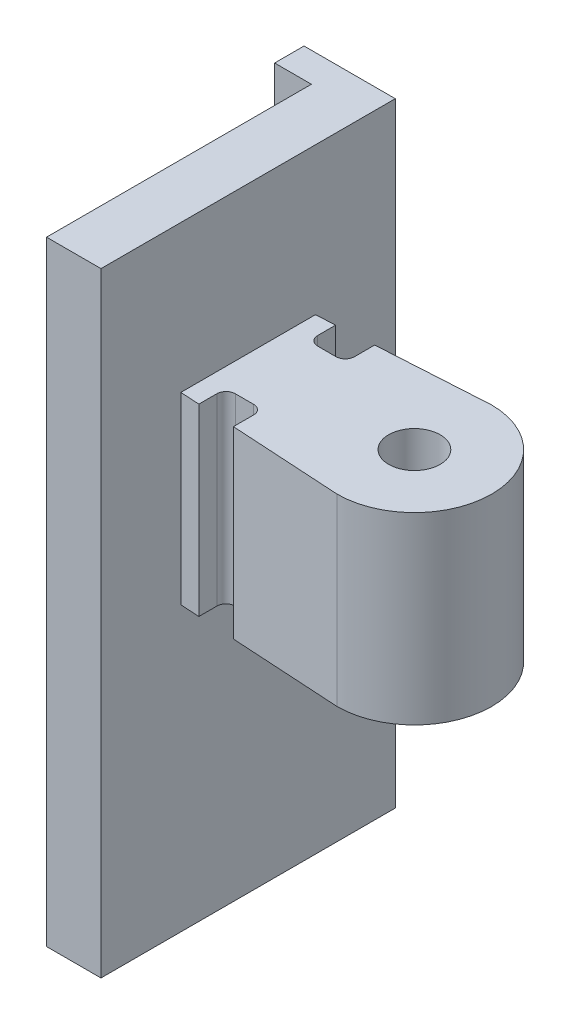
ISO-10303-21;
HEADER;
FILE_DESCRIPTION(('STEP AP214'),'2;1');
FILE_NAME('part.step','',(''),(''),'','','');
FILE_SCHEMA(('AUTOMOTIVE_DESIGN { 1 0 10303 214 1 1 1 1 }'));
ENDSEC;
DATA;
#1=APPLICATION_CONTEXT('core data for automotive mechanical design processes');
#2=APPLICATION_PROTOCOL_DEFINITION('international standard','automotive_design',2000,#1);
#3=PRODUCT_CONTEXT('',#1,'mechanical');
#4=PRODUCT('Part','Part','',(#3));
#5=PRODUCT_RELATED_PRODUCT_CATEGORY('part','',(#4));
#6=PRODUCT_DEFINITION_FORMATION('','',#4);
#7=PRODUCT_DEFINITION_CONTEXT('part definition',#1,'design');
#8=PRODUCT_DEFINITION('design','',#6,#7);
#9=PRODUCT_DEFINITION_SHAPE('','',#8);
#10=(LENGTH_UNIT() NAMED_UNIT(*) SI_UNIT(.MILLI.,.METRE.));
#11=(NAMED_UNIT(*) PLANE_ANGLE_UNIT() SI_UNIT($,.RADIAN.));
#12=(NAMED_UNIT(*) SI_UNIT($,.STERADIAN.) SOLID_ANGLE_UNIT());
#13=UNCERTAINTY_MEASURE_WITH_UNIT(LENGTH_MEASURE(1.E-05),#10,'distance_accuracy_value','');
#14=(GEOMETRIC_REPRESENTATION_CONTEXT(3) GLOBAL_UNCERTAINTY_ASSIGNED_CONTEXT((#13)) GLOBAL_UNIT_ASSIGNED_CONTEXT((#10,
#11,#12)) REPRESENTATION_CONTEXT('',''));
#15=CARTESIAN_POINT('',(0.,0.,0.));
#16=DIRECTION('',(0.,0.,1.));
#17=DIRECTION('',(1.,0.,0.));
#18=AXIS2_PLACEMENT_3D('',#15,#16,#17);
#19=CARTESIAN_POINT('',(-2.26000000000002,0.,0.));
#20=DIRECTION('',(-1.,0.,0.));
#21=DIRECTION('',(0.,0.,1.));
#22=AXIS2_PLACEMENT_3D('',#19,#20,#21);
#23=PLANE('',#22);
#24=DIRECTION('',(0.,-1.,0.));
#25=VECTOR('',#24,1.);
#26=CARTESIAN_POINT('',(-2.26000000000002,4.5,-2.));
#27=LINE('',#26,#25);
#28=CARTESIAN_POINT('',(-2.26000000000002,4.5,-2.));
#29=VERTEX_POINT('',#28);
#30=CARTESIAN_POINT('',(-2.26000000000002,-3.85,-2.));
#31=VERTEX_POINT('',#30);
#32=EDGE_CURVE('E190',#29,#31,#27,.T.);
#33=ORIENTED_EDGE('',*,*,#32,.F.);
#34=DIRECTION('',(0.,0.,-1.));
#35=VECTOR('',#34,1.);
#36=CARTESIAN_POINT('',(-2.26000000000002,4.5,-2.));
#37=LINE('',#36,#35);
#38=CARTESIAN_POINT('',(-2.26000000000002,4.5,2.));
#39=VERTEX_POINT('',#38);
#40=EDGE_CURVE('E195',#39,#29,#37,.T.);
#41=ORIENTED_EDGE('',*,*,#40,.F.);
#42=DIRECTION('',(0.,1.,0.));
#43=VECTOR('',#42,1.);
#44=CARTESIAN_POINT('',(-2.26000000000002,4.5,2.));
#45=LINE('',#44,#43);
#46=CARTESIAN_POINT('',(-2.26000000000002,-3.85,2.));
#47=VERTEX_POINT('',#46);
#48=EDGE_CURVE('E230',#47,#39,#45,.T.);
#49=ORIENTED_EDGE('',*,*,#48,.F.);
#50=DIRECTION('',(0.,0.,1.));
#51=VECTOR('',#50,1.);
#52=CARTESIAN_POINT('',(-2.26000000000002,-3.85,-2.));
#53=LINE('',#52,#51);
#54=EDGE_CURVE('E228',#31,#47,#53,.T.);
#55=ORIENTED_EDGE('',*,*,#54,.F.);
#56=EDGE_LOOP('',(#33,#41,#49,#55));
#57=FACE_BOUND('',#56,.T.);
#58=DIRECTION('',(0.,1.,0.));
#59=VECTOR('',#58,1.);
#60=CARTESIAN_POINT('',(-2.26000000000002,2.5,0.9144));
#61=LINE('',#60,#59);
#62=CARTESIAN_POINT('',(-2.26000000000002,0.,0.9144));
#63=VERTEX_POINT('',#62);
#64=CARTESIAN_POINT('',(-2.26000000000002,2.5,0.9144));
#65=VERTEX_POINT('',#64);
#66=EDGE_CURVE('E241',#63,#65,#61,.T.);
#67=ORIENTED_EDGE('',*,*,#66,.T.);
#68=DIRECTION('',(0.,0.,-1.));
#69=VECTOR('',#68,1.);
#70=CARTESIAN_POINT('',(-2.26000000000002,2.5,0.));
#71=LINE('',#70,#69);
#72=CARTESIAN_POINT('',(-2.26000000000002,2.5,-0.9144));
#73=VERTEX_POINT('',#72);
#74=EDGE_CURVE('E243',#65,#73,#71,.T.);
#75=ORIENTED_EDGE('',*,*,#74,.T.);
#76=DIRECTION('',(0.,1.,0.));
#77=VECTOR('',#76,1.);
#78=CARTESIAN_POINT('',(-2.26000000000002,2.5,-0.9144));
#79=LINE('',#78,#77);
#80=CARTESIAN_POINT('',(-2.26000000000002,0.,-0.9144));
#81=VERTEX_POINT('',#80);
#82=EDGE_CURVE('E59',#81,#73,#79,.T.);
#83=ORIENTED_EDGE('',*,*,#82,.F.);
#84=DIRECTION('',(0.,0.,-1.));
#85=VECTOR('',#84,1.);
#86=CARTESIAN_POINT('',(-2.26000000000002,0.,0.));
#87=LINE('',#86,#85);
#88=EDGE_CURVE('E11',#63,#81,#87,.T.);
#89=ORIENTED_EDGE('',*,*,#88,.F.);
#90=EDGE_LOOP('',(#67,#75,#83,#89));
#91=FACE_BOUND('',#90,.T.);
#92=ADVANCED_FACE('F36',(#57,#91),#23,.F.);
#93=CARTESIAN_POINT('',(-2.26000000000002,4.5,-2.));
#94=DIRECTION('',(0.,0.,-1.));
#95=DIRECTION('',(0.,1.,0.));
#96=AXIS2_PLACEMENT_3D('',#93,#94,#95);
#97=PLANE('',#96);
#98=DIRECTION('',(-1.,0.,0.));
#99=VECTOR('',#98,1.);
#100=CARTESIAN_POINT('',(-2.26000000000002,-3.85,-2.));
#101=LINE('',#100,#99);
#102=CARTESIAN_POINT('',(-3.50000000000002,-3.85,-2.));
#103=VERTEX_POINT('',#102);
#104=EDGE_CURVE('E184',#31,#103,#101,.T.);
#105=ORIENTED_EDGE('',*,*,#104,.T.);
#106=DIRECTION('',(0.,-1.,0.));
#107=VECTOR('',#106,1.);
#108=CARTESIAN_POINT('',(-3.50000000000002,-3.85,-2.));
#109=LINE('',#108,#107);
#110=CARTESIAN_POINT('',(-3.50000000000002,4.5,-2.));
#111=VERTEX_POINT('',#110);
#112=EDGE_CURVE('E188',#111,#103,#109,.T.);
#113=ORIENTED_EDGE('',*,*,#112,.F.);
#114=DIRECTION('',(-1.,0.,0.));
#115=VECTOR('',#114,1.);
#116=CARTESIAN_POINT('',(-2.26000000000002,4.5,-2.));
#117=LINE('',#116,#115);
#118=EDGE_CURVE('E235',#29,#111,#117,.T.);
#119=ORIENTED_EDGE('',*,*,#118,.F.);
#120=ORIENTED_EDGE('',*,*,#32,.T.);
#121=EDGE_LOOP('',(#105,#113,#119,#120));
#122=FACE_BOUND('',#121,.T.);
#123=ADVANCED_FACE('F186',(#122),#97,.T.);
#124=CARTESIAN_POINT('',(-2.26000000000002,4.5,-2.));
#125=DIRECTION('',(0.,1.,0.));
#126=DIRECTION('',(0.,0.,1.));
#127=AXIS2_PLACEMENT_3D('',#124,#125,#126);
#128=PLANE('',#127);
#129=ORIENTED_EDGE('',*,*,#118,.T.);
#130=DIRECTION('',(0.,0.,-1.));
#131=VECTOR('',#130,1.);
#132=CARTESIAN_POINT('',(-3.50000000000002,4.5,-2.));
#133=LINE('',#132,#131);
#134=CARTESIAN_POINT('',(-3.50000000000002,4.5,-1.6));
#135=VERTEX_POINT('',#134);
#136=EDGE_CURVE('E210',#135,#111,#133,.T.);
#137=ORIENTED_EDGE('',*,*,#136,.F.);
#138=DIRECTION('',(1.,0.,0.));
#139=VECTOR('',#138,1.);
#140=CARTESIAN_POINT('',(-3.50000000000002,4.5,-1.6));
#141=LINE('',#140,#139);
#142=CARTESIAN_POINT('',(-3.00000000000002,4.5,-1.6));
#143=VERTEX_POINT('',#142);
#144=EDGE_CURVE('E215',#135,#143,#141,.T.);
#145=ORIENTED_EDGE('',*,*,#144,.T.);
#146=DIRECTION('',(0.,0.,-1.));
#147=VECTOR('',#146,1.);
#148=CARTESIAN_POINT('',(-3.00000000000002,4.5,-2.));
#149=LINE('',#148,#147);
#150=CARTESIAN_POINT('',(-3.00000000000002,4.5,2.));
#151=VERTEX_POINT('',#150);
#152=EDGE_CURVE('E225',#151,#143,#149,.T.);
#153=ORIENTED_EDGE('',*,*,#152,.F.);
#154=DIRECTION('',(-1.,0.,0.));
#155=VECTOR('',#154,1.);
#156=CARTESIAN_POINT('',(-2.26000000000002,4.5,2.));
#157=LINE('',#156,#155);
#158=EDGE_CURVE('E237',#39,#151,#157,.T.);
#159=ORIENTED_EDGE('',*,*,#158,.F.);
#160=ORIENTED_EDGE('',*,*,#40,.T.);
#161=EDGE_LOOP('',(#129,#137,#145,#153,#159,#160));
#162=FACE_BOUND('',#161,.T.);
#163=ADVANCED_FACE('F437',(#162),#128,.T.);
#164=CARTESIAN_POINT('',(-2.26000000000002,4.5,2.));
#165=DIRECTION('',(0.,0.,1.));
#166=DIRECTION('',(0.,-1.,0.));
#167=AXIS2_PLACEMENT_3D('',#164,#165,#166);
#168=PLANE('',#167);
#169=ORIENTED_EDGE('',*,*,#158,.T.);
#170=DIRECTION('',(0.,1.,0.));
#171=VECTOR('',#170,1.);
#172=CARTESIAN_POINT('',(-3.00000000000002,4.5,2.));
#173=LINE('',#172,#171);
#174=CARTESIAN_POINT('',(-3.00000000000002,-3.85,2.));
#175=VERTEX_POINT('',#174);
#176=EDGE_CURVE('E222',#175,#151,#173,.T.);
#177=ORIENTED_EDGE('',*,*,#176,.F.);
#178=DIRECTION('',(-1.,0.,0.));
#179=VECTOR('',#178,1.);
#180=CARTESIAN_POINT('',(-2.26000000000002,-3.85,2.));
#181=LINE('',#180,#179);
#182=EDGE_CURVE('E194',#47,#175,#181,.T.);
#183=ORIENTED_EDGE('',*,*,#182,.F.);
#184=ORIENTED_EDGE('',*,*,#48,.T.);
#185=EDGE_LOOP('',(#169,#177,#183,#184));
#186=FACE_BOUND('',#185,.T.);
#187=ADVANCED_FACE('F445',(#186),#168,.T.);
#188=CARTESIAN_POINT('',(-2.26000000000002,-3.85,-2.));
#189=DIRECTION('',(0.,-1.,0.));
#190=DIRECTION('',(0.,0.,-1.));
#191=AXIS2_PLACEMENT_3D('',#188,#189,#190);
#192=PLANE('',#191);
#193=ORIENTED_EDGE('',*,*,#182,.T.);
#194=DIRECTION('',(0.,0.,1.));
#195=VECTOR('',#194,1.);
#196=CARTESIAN_POINT('',(-3.00000000000002,-3.85,-2.));
#197=LINE('',#196,#195);
#198=CARTESIAN_POINT('',(-3.00000000000002,-3.85,-1.6));
#199=VERTEX_POINT('',#198);
#200=EDGE_CURVE('E220',#199,#175,#197,.T.);
#201=ORIENTED_EDGE('',*,*,#200,.F.);
#202=DIRECTION('',(1.,0.,0.));
#203=VECTOR('',#202,1.);
#204=CARTESIAN_POINT('',(-3.50000000000002,-3.85,-1.6));
#205=LINE('',#204,#203);
#206=CARTESIAN_POINT('',(-3.50000000000002,-3.85,-1.6));
#207=VERTEX_POINT('',#206);
#208=EDGE_CURVE('E202',#207,#199,#205,.T.);
#209=ORIENTED_EDGE('',*,*,#208,.F.);
#210=DIRECTION('',(0.,0.,1.));
#211=VECTOR('',#210,1.);
#212=CARTESIAN_POINT('',(-3.50000000000002,-3.85,-1.6));
#213=LINE('',#212,#211);
#214=EDGE_CURVE('E198',#103,#207,#213,.T.);
#215=ORIENTED_EDGE('',*,*,#214,.F.);
#216=ORIENTED_EDGE('',*,*,#104,.F.);
#217=ORIENTED_EDGE('',*,*,#54,.T.);
#218=EDGE_LOOP('',(#193,#201,#209,#215,#216,#217));
#219=FACE_BOUND('',#218,.T.);
#220=ADVANCED_FACE('F200',(#219),#192,.T.);
#221=CARTESIAN_POINT('',(-3.00000000000002,0.,0.));
#222=DIRECTION('',(-1.,0.,0.));
#223=DIRECTION('',(0.,0.,1.));
#224=AXIS2_PLACEMENT_3D('',#221,#222,#223);
#225=PLANE('',#224);
#226=DIRECTION('',(0.,1.,0.));
#227=VECTOR('',#226,1.);
#228=CARTESIAN_POINT('',(-3.00000000000002,4.5,-1.6));
#229=LINE('',#228,#227);
#230=EDGE_CURVE('E51',#199,#143,#229,.T.);
#231=ORIENTED_EDGE('',*,*,#230,.F.);
#232=ORIENTED_EDGE('',*,*,#200,.T.);
#233=ORIENTED_EDGE('',*,*,#176,.T.);
#234=ORIENTED_EDGE('',*,*,#152,.T.);
#235=EDGE_LOOP('',(#231,#232,#233,#234));
#236=FACE_BOUND('',#235,.T.);
#237=ADVANCED_FACE('F441',(#236),#225,.T.);
#238=CARTESIAN_POINT('',(-2.50000000000002,2.5,0.9));
#239=DIRECTION('',(0.0598922907279451,0.,-0.998204845465779));
#240=DIRECTION('',(-0.998204845465779,0.,-0.0598922907279451));
#241=AXIS2_PLACEMENT_3D('',#238,#239,#240);
#242=PLANE('',#241);
#243=ORIENTED_EDGE('',*,*,#66,.F.);
#244=DIRECTION('',(0.998204845465779,0.,0.0598922907279451));
#245=VECTOR('',#244,1.);
#246=CARTESIAN_POINT('',(-2.50000000000002,0.,0.9));
#247=LINE('',#246,#245);
#248=CARTESIAN_POINT('',(-2.,0.,0.93));
#249=VERTEX_POINT('',#248);
#250=EDGE_CURVE('E249',#63,#249,#247,.T.);
#251=ORIENTED_EDGE('',*,*,#250,.T.);
#252=DIRECTION('',(0.,-1.,0.));
#253=VECTOR('',#252,1.);
#254=CARTESIAN_POINT('',(-2.,2.5,0.93));
#255=LINE('',#254,#253);
#256=CARTESIAN_POINT('',(-2.,2.5,0.93));
#257=VERTEX_POINT('',#256);
#258=EDGE_CURVE('E323',#257,#249,#255,.T.);
#259=ORIENTED_EDGE('',*,*,#258,.F.);
#260=DIRECTION('',(0.998204845465779,0.,0.0598922907279451));
#261=VECTOR('',#260,1.);
#262=CARTESIAN_POINT('',(-2.50000000000002,2.5,0.9));
#263=LINE('',#262,#261);
#264=EDGE_CURVE('E252',#65,#257,#263,.T.);
#265=ORIENTED_EDGE('',*,*,#264,.F.);
#266=EDGE_LOOP('',(#243,#251,#259,#265));
#267=FACE_BOUND('',#266,.T.);
#268=ADVANCED_FACE('F427',(#267),#242,.F.);
#269=CARTESIAN_POINT('',(-2.50000000000002,2.5,-0.9));
#270=DIRECTION('',(-0.0598922907279451,0.,-0.998204845465779));
#271=DIRECTION('',(-0.998204845465779,0.,0.0598922907279451));
#272=AXIS2_PLACEMENT_3D('',#269,#270,#271);
#273=PLANE('',#272);
#274=DIRECTION('',(0.998204845465779,0.,-0.0598922907279451));
#275=VECTOR('',#274,1.);
#276=CARTESIAN_POINT('',(-2.50000000000002,0.,-0.9));
#277=LINE('',#276,#275);
#278=CARTESIAN_POINT('',(-2.,0.,-0.93));
#279=VERTEX_POINT('',#278);
#280=EDGE_CURVE('E255',#81,#279,#277,.T.);
#281=ORIENTED_EDGE('',*,*,#280,.F.);
#282=ORIENTED_EDGE('',*,*,#82,.T.);
#283=DIRECTION('',(0.998204845465779,0.,-0.0598922907279451));
#284=VECTOR('',#283,1.);
#285=CARTESIAN_POINT('',(-2.50000000000002,2.5,-0.9));
#286=LINE('',#285,#284);
#287=CARTESIAN_POINT('',(-2.,2.5,-0.93));
#288=VERTEX_POINT('',#287);
#289=EDGE_CURVE('E281',#73,#288,#286,.T.);
#290=ORIENTED_EDGE('',*,*,#289,.T.);
#291=DIRECTION('',(0.,-1.,0.));
#292=VECTOR('',#291,1.);
#293=CARTESIAN_POINT('',(-2.,2.5,-0.93));
#294=LINE('',#293,#292);
#295=EDGE_CURVE('E283',#288,#279,#294,.T.);
#296=ORIENTED_EDGE('',*,*,#295,.T.);
#297=EDGE_LOOP('',(#281,#282,#290,#296));
#298=FACE_BOUND('',#297,.T.);
#299=ADVANCED_FACE('F430',(#298),#273,.T.);
#300=CARTESIAN_POINT('',(0.,2.5,0.));
#301=DIRECTION('',(0.,-1.,0.));
#302=DIRECTION('',(0.,0.,-1.));
#303=AXIS2_PLACEMENT_3D('',#300,#301,#302);
#304=PLANE('',#303);
#305=CARTESIAN_POINT('',(0.,2.5,0.));
#306=DIRECTION('',(0.,1.,0.));
#307=DIRECTION('',(0.,0.,1.));
#308=AXIS2_PLACEMENT_3D('',#305,#306,#307);
#309=CIRCLE('',#308,0.35);
#310=CARTESIAN_POINT('',(0.,2.5,0.35));
#311=VERTEX_POINT('',#310);
#312=EDGE_CURVE('E245',#311,#311,#309,.T.);
#313=ORIENTED_EDGE('',*,*,#312,.F.);
#314=EDGE_LOOP('',(#313));
#315=FACE_BOUND('',#314,.T.);
#316=ORIENTED_EDGE('',*,*,#74,.F.);
#317=ORIENTED_EDGE('',*,*,#264,.T.);
#318=DIRECTION('',(0.,0.,-1.));
#319=VECTOR('',#318,1.);
#320=CARTESIAN_POINT('',(-2.,2.5,0.93));
#321=LINE('',#320,#319);
#322=CARTESIAN_POINT('',(-2.,2.5,0.685));
#323=VERTEX_POINT('',#322);
#324=EDGE_CURVE('E254',#257,#323,#321,.T.);
#325=ORIENTED_EDGE('',*,*,#324,.T.);
#326=CARTESIAN_POINT('',(-1.875,2.5,0.685));
#327=DIRECTION('',(0.,-1.,0.));
#328=DIRECTION('',(0.,0.,-1.));
#329=AXIS2_PLACEMENT_3D('',#326,#327,#328);
#330=CIRCLE('',#329,0.125);
#331=CARTESIAN_POINT('',(-1.875,2.5,0.56));
#332=VERTEX_POINT('',#331);
#333=EDGE_CURVE('E348',#323,#332,#330,.T.);
#334=ORIENTED_EDGE('',*,*,#333,.T.);
#335=DIRECTION('',(-1.,0.,0.));
#336=VECTOR('',#335,1.);
#337=CARTESIAN_POINT('',(-1.5,2.5,0.56));
#338=LINE('',#337,#336);
#339=CARTESIAN_POINT('',(-1.625,2.5,0.56));
#340=VERTEX_POINT('',#339);
#341=EDGE_CURVE('E258',#340,#332,#338,.T.);
#342=ORIENTED_EDGE('',*,*,#341,.F.);
#343=CARTESIAN_POINT('',(-1.625,2.5,0.685));
#344=DIRECTION('',(0.,-1.,0.));
#345=DIRECTION('',(0.,0.,-1.));
#346=AXIS2_PLACEMENT_3D('',#343,#344,#345);
#347=CIRCLE('',#346,0.125);
#348=CARTESIAN_POINT('',(-1.5,2.5,0.685));
#349=VERTEX_POINT('',#348);
#350=EDGE_CURVE('E352',#340,#349,#347,.T.);
#351=ORIENTED_EDGE('',*,*,#350,.T.);
#352=DIRECTION('',(0.,0.,1.));
#353=VECTOR('',#352,1.);
#354=CARTESIAN_POINT('',(-1.5,2.5,0.56));
#355=LINE('',#354,#353);
#356=CARTESIAN_POINT('',(-1.5,2.5,0.96));
#357=VERTEX_POINT('',#356);
#358=EDGE_CURVE('E261',#349,#357,#355,.T.);
#359=ORIENTED_EDGE('',*,*,#358,.T.);
#360=DIRECTION('',(-0.998204845465779,0.,-0.0598922907279466));
#361=VECTOR('',#360,1.);
#362=CARTESIAN_POINT('',(0.,2.5,1.05));
#363=LINE('',#362,#361);
#364=CARTESIAN_POINT('',(0.,2.5,1.05));
#365=VERTEX_POINT('',#364);
#366=EDGE_CURVE('E263',#365,#357,#363,.T.);
#367=ORIENTED_EDGE('',*,*,#366,.F.);
#368=CARTESIAN_POINT('',(0.,2.5,0.));
#369=DIRECTION('',(0.,-1.,0.));
#370=DIRECTION('',(0.,0.,-1.));
#371=AXIS2_PLACEMENT_3D('',#368,#369,#370);
#372=CIRCLE('',#371,1.05);
#373=CARTESIAN_POINT('',(0.,2.5,-1.05));
#374=VERTEX_POINT('',#373);
#375=EDGE_CURVE('E266',#374,#365,#372,.T.);
#376=ORIENTED_EDGE('',*,*,#375,.F.);
#377=DIRECTION('',(0.998204845465779,0.,-0.0598922907279466));
#378=VECTOR('',#377,1.);
#379=CARTESIAN_POINT('',(-1.5,2.5,-0.96));
#380=LINE('',#379,#378);
#381=CARTESIAN_POINT('',(-1.5,2.5,-0.96));
#382=VERTEX_POINT('',#381);
#383=EDGE_CURVE('E269',#382,#374,#380,.T.);
#384=ORIENTED_EDGE('',*,*,#383,.F.);
#385=DIRECTION('',(0.,0.,1.));
#386=VECTOR('',#385,1.);
#387=CARTESIAN_POINT('',(-1.5,2.5,-0.96));
#388=LINE('',#387,#386);
#389=CARTESIAN_POINT('',(-1.5,2.5,-0.685));
#390=VERTEX_POINT('',#389);
#391=EDGE_CURVE('E272',#382,#390,#388,.T.);
#392=ORIENTED_EDGE('',*,*,#391,.T.);
#393=CARTESIAN_POINT('',(-1.625,2.5,-0.685));
#394=DIRECTION('',(0.,-1.,0.));
#395=DIRECTION('',(0.,0.,-1.));
#396=AXIS2_PLACEMENT_3D('',#393,#394,#395);
#397=CIRCLE('',#396,0.125);
#398=CARTESIAN_POINT('',(-1.625,2.5,-0.56));
#399=VERTEX_POINT('',#398);
#400=EDGE_CURVE('E356',#390,#399,#397,.T.);
#401=ORIENTED_EDGE('',*,*,#400,.T.);
#402=DIRECTION('',(1.,0.,0.));
#403=VECTOR('',#402,1.);
#404=CARTESIAN_POINT('',(-2.,2.5,-0.56));
#405=LINE('',#404,#403);
#406=CARTESIAN_POINT('',(-1.875,2.5,-0.56));
#407=VERTEX_POINT('',#406);
#408=EDGE_CURVE('E275',#407,#399,#405,.T.);
#409=ORIENTED_EDGE('',*,*,#408,.F.);
#410=CARTESIAN_POINT('',(-1.875,2.5,-0.685));
#411=DIRECTION('',(0.,-1.,0.));
#412=DIRECTION('',(0.,0.,-1.));
#413=AXIS2_PLACEMENT_3D('',#410,#411,#412);
#414=CIRCLE('',#413,0.125);
#415=CARTESIAN_POINT('',(-2.,2.5,-0.685));
#416=VERTEX_POINT('',#415);
#417=EDGE_CURVE('E44',#407,#416,#414,.T.);
#418=ORIENTED_EDGE('',*,*,#417,.T.);
#419=DIRECTION('',(0.,0.,1.));
#420=VECTOR('',#419,1.);
#421=CARTESIAN_POINT('',(-2.,2.5,-0.93));
#422=LINE('',#421,#420);
#423=EDGE_CURVE('E278',#288,#416,#422,.T.);
#424=ORIENTED_EDGE('',*,*,#423,.F.);
#425=ORIENTED_EDGE('',*,*,#289,.F.);
#426=EDGE_LOOP('',(#316,#317,#325,#334,#342,#351,#359,#367,#376,#384,#392,#401,#409,#418,#424,#425));
#427=FACE_BOUND('',#426,.T.);
#428=ADVANCED_FACE('F364',(#315,#427),#304,.F.);
#429=CARTESIAN_POINT('',(0.,0.,0.));
#430=DIRECTION('',(0.,-1.,0.));
#431=DIRECTION('',(0.,0.,-1.));
#432=AXIS2_PLACEMENT_3D('',#429,#430,#431);
#433=PLANE('',#432);
#434=CARTESIAN_POINT('',(0.,0.,0.));
#435=DIRECTION('',(0.,1.,0.));
#436=DIRECTION('',(0.,0.,1.));
#437=AXIS2_PLACEMENT_3D('',#434,#435,#436);
#438=CIRCLE('',#437,0.35);
#439=CARTESIAN_POINT('',(0.,0.,0.35));
#440=VERTEX_POINT('',#439);
#441=EDGE_CURVE('E246',#440,#440,#438,.T.);
#442=ORIENTED_EDGE('',*,*,#441,.T.);
#443=EDGE_LOOP('',(#442));
#444=FACE_BOUND('',#443,.T.);
#445=ORIENTED_EDGE('',*,*,#250,.F.);
#446=ORIENTED_EDGE('',*,*,#88,.T.);
#447=ORIENTED_EDGE('',*,*,#280,.T.);
#448=DIRECTION('',(0.,0.,1.));
#449=VECTOR('',#448,1.);
#450=CARTESIAN_POINT('',(-2.,0.,-0.93));
#451=LINE('',#450,#449);
#452=CARTESIAN_POINT('',(-2.,0.,-0.685));
#453=VERTEX_POINT('',#452);
#454=EDGE_CURVE('E308',#279,#453,#451,.T.);
#455=ORIENTED_EDGE('',*,*,#454,.T.);
#456=CARTESIAN_POINT('',(-1.875,0.,-0.685));
#457=DIRECTION('',(0.,-1.,0.));
#458=DIRECTION('',(0.,0.,-1.));
#459=AXIS2_PLACEMENT_3D('',#456,#457,#458);
#460=CIRCLE('',#459,0.125);
#461=CARTESIAN_POINT('',(-1.875,0.,-0.56));
#462=VERTEX_POINT('',#461);
#463=EDGE_CURVE('E358',#453,#462,#460,.F.);
#464=ORIENTED_EDGE('',*,*,#463,.T.);
#465=DIRECTION('',(1.,0.,0.));
#466=VECTOR('',#465,1.);
#467=CARTESIAN_POINT('',(-2.,0.,-0.56));
#468=LINE('',#467,#466);
#469=CARTESIAN_POINT('',(-1.625,0.,-0.56));
#470=VERTEX_POINT('',#469);
#471=EDGE_CURVE('E305',#462,#470,#468,.T.);
#472=ORIENTED_EDGE('',*,*,#471,.T.);
#473=CARTESIAN_POINT('',(-1.625,0.,-0.685));
#474=DIRECTION('',(0.,-1.,0.));
#475=DIRECTION('',(0.,0.,-1.));
#476=AXIS2_PLACEMENT_3D('',#473,#474,#475);
#477=CIRCLE('',#476,0.125);
#478=CARTESIAN_POINT('',(-1.5,0.,-0.685));
#479=VERTEX_POINT('',#478);
#480=EDGE_CURVE('E354',#470,#479,#477,.F.);
#481=ORIENTED_EDGE('',*,*,#480,.T.);
#482=DIRECTION('',(0.,0.,1.));
#483=VECTOR('',#482,1.);
#484=CARTESIAN_POINT('',(-1.5,0.,-0.96));
#485=LINE('',#484,#483);
#486=CARTESIAN_POINT('',(-1.5,0.,-0.96));
#487=VERTEX_POINT('',#486);
#488=EDGE_CURVE('E302',#487,#479,#485,.T.);
#489=ORIENTED_EDGE('',*,*,#488,.F.);
#490=DIRECTION('',(0.998204845465779,0.,-0.0598922907279466));
#491=VECTOR('',#490,1.);
#492=CARTESIAN_POINT('',(-1.5,0.,-0.96));
#493=LINE('',#492,#491);
#494=CARTESIAN_POINT('',(0.,0.,-1.05));
#495=VERTEX_POINT('',#494);
#496=EDGE_CURVE('E299',#487,#495,#493,.T.);
#497=ORIENTED_EDGE('',*,*,#496,.T.);
#498=CARTESIAN_POINT('',(0.,0.,0.));
#499=DIRECTION('',(0.,-1.,0.));
#500=DIRECTION('',(0.,0.,-1.));
#501=AXIS2_PLACEMENT_3D('',#498,#499,#500);
#502=CIRCLE('',#501,1.05);
#503=CARTESIAN_POINT('',(0.,0.,1.05));
#504=VERTEX_POINT('',#503);
#505=EDGE_CURVE('E296',#495,#504,#502,.T.);
#506=ORIENTED_EDGE('',*,*,#505,.T.);
#507=DIRECTION('',(-0.998204845465779,0.,-0.0598922907279466));
#508=VECTOR('',#507,1.);
#509=CARTESIAN_POINT('',(0.,0.,1.05));
#510=LINE('',#509,#508);
#511=CARTESIAN_POINT('',(-1.5,0.,0.96));
#512=VERTEX_POINT('',#511);
#513=EDGE_CURVE('E293',#504,#512,#510,.T.);
#514=ORIENTED_EDGE('',*,*,#513,.T.);
#515=DIRECTION('',(0.,0.,1.));
#516=VECTOR('',#515,1.);
#517=CARTESIAN_POINT('',(-1.5,0.,0.56));
#518=LINE('',#517,#516);
#519=CARTESIAN_POINT('',(-1.5,0.,0.685));
#520=VERTEX_POINT('',#519);
#521=EDGE_CURVE('E291',#520,#512,#518,.T.);
#522=ORIENTED_EDGE('',*,*,#521,.F.);
#523=CARTESIAN_POINT('',(-1.625,0.,0.685));
#524=DIRECTION('',(0.,-1.,0.));
#525=DIRECTION('',(0.,0.,-1.));
#526=AXIS2_PLACEMENT_3D('',#523,#524,#525);
#527=CIRCLE('',#526,0.125);
#528=CARTESIAN_POINT('',(-1.625,0.,0.56));
#529=VERTEX_POINT('',#528);
#530=EDGE_CURVE('E350',#520,#529,#527,.F.);
#531=ORIENTED_EDGE('',*,*,#530,.T.);
#532=DIRECTION('',(-1.,0.,0.));
#533=VECTOR('',#532,1.);
#534=CARTESIAN_POINT('',(-1.5,0.,0.56));
#535=LINE('',#534,#533);
#536=CARTESIAN_POINT('',(-1.875,0.,0.56));
#537=VERTEX_POINT('',#536);
#538=EDGE_CURVE('E288',#529,#537,#535,.T.);
#539=ORIENTED_EDGE('',*,*,#538,.T.);
#540=CARTESIAN_POINT('',(-1.875,0.,0.685));
#541=DIRECTION('',(0.,-1.,0.));
#542=DIRECTION('',(0.,0.,-1.));
#543=AXIS2_PLACEMENT_3D('',#540,#541,#542);
#544=CIRCLE('',#543,0.125);
#545=CARTESIAN_POINT('',(-2.,0.,0.685));
#546=VERTEX_POINT('',#545);
#547=EDGE_CURVE('E346',#537,#546,#544,.F.);
#548=ORIENTED_EDGE('',*,*,#547,.T.);
#549=DIRECTION('',(0.,0.,-1.));
#550=VECTOR('',#549,1.);
#551=CARTESIAN_POINT('',(-2.,0.,0.93));
#552=LINE('',#551,#550);
#553=EDGE_CURVE('E285',#249,#546,#552,.T.);
#554=ORIENTED_EDGE('',*,*,#553,.F.);
#555=EDGE_LOOP('',(#445,#446,#447,#455,#464,#472,#481,#489,#497,#506,#514,#522,#531,#539,#548,#554));
#556=FACE_BOUND('',#555,.T.);
#557=ADVANCED_FACE('F376',(#444,#556),#433,.T.);
#558=CARTESIAN_POINT('',(-2.,2.5,0.93));
#559=DIRECTION('',(-1.,0.,0.));
#560=DIRECTION('',(0.,0.,1.));
#561=AXIS2_PLACEMENT_3D('',#558,#559,#560);
#562=PLANE('',#561);
#563=ORIENTED_EDGE('',*,*,#553,.T.);
#564=DIRECTION('',(0.,-1.,0.));
#565=VECTOR('',#564,1.);
#566=CARTESIAN_POINT('',(-2.,2.5,0.685));
#567=LINE('',#566,#565);
#568=EDGE_CURVE('E331',#546,#323,#567,.F.);
#569=ORIENTED_EDGE('',*,*,#568,.T.);
#570=ORIENTED_EDGE('',*,*,#324,.F.);
#571=ORIENTED_EDGE('',*,*,#258,.T.);
#572=EDGE_LOOP('',(#563,#569,#570,#571));
#573=FACE_BOUND('',#572,.T.);
#574=ADVANCED_FACE('F421',(#573),#562,.F.);
#575=CARTESIAN_POINT('',(-1.5,2.5,0.56));
#576=DIRECTION('',(0.,0.,1.));
#577=DIRECTION('',(1.,0.,0.));
#578=AXIS2_PLACEMENT_3D('',#575,#576,#577);
#579=PLANE('',#578);
#580=ORIENTED_EDGE('',*,*,#341,.T.);
#581=DIRECTION('',(0.,-1.,0.));
#582=VECTOR('',#581,1.);
#583=CARTESIAN_POINT('',(-1.875,2.5,0.56));
#584=LINE('',#583,#582);
#585=EDGE_CURVE('E328',#332,#537,#584,.T.);
#586=ORIENTED_EDGE('',*,*,#585,.T.);
#587=ORIENTED_EDGE('',*,*,#538,.F.);
#588=DIRECTION('',(0.,-1.,0.));
#589=VECTOR('',#588,1.);
#590=CARTESIAN_POINT('',(-1.625,2.5,0.56));
#591=LINE('',#590,#589);
#592=EDGE_CURVE('E326',#529,#340,#591,.F.);
#593=ORIENTED_EDGE('',*,*,#592,.T.);
#594=EDGE_LOOP('',(#580,#586,#587,#593));
#595=FACE_BOUND('',#594,.T.);
#596=ADVANCED_FACE('F410',(#595),#579,.T.);
#597=CARTESIAN_POINT('',(-1.5,2.5,0.56));
#598=DIRECTION('',(1.,0.,0.));
#599=DIRECTION('',(0.,0.,-1.));
#600=AXIS2_PLACEMENT_3D('',#597,#598,#599);
#601=PLANE('',#600);
#602=ORIENTED_EDGE('',*,*,#358,.F.);
#603=DIRECTION('',(0.,-1.,0.));
#604=VECTOR('',#603,1.);
#605=CARTESIAN_POINT('',(-1.5,2.5,0.685));
#606=LINE('',#605,#604);
#607=EDGE_CURVE('E333',#349,#520,#606,.T.);
#608=ORIENTED_EDGE('',*,*,#607,.T.);
#609=ORIENTED_EDGE('',*,*,#521,.T.);
#610=DIRECTION('',(0.,-1.,0.));
#611=VECTOR('',#610,1.);
#612=CARTESIAN_POINT('',(-1.5,2.5,0.96));
#613=LINE('',#612,#611);
#614=EDGE_CURVE('E320',#357,#512,#613,.T.);
#615=ORIENTED_EDGE('',*,*,#614,.F.);
#616=EDGE_LOOP('',(#602,#608,#609,#615));
#617=FACE_BOUND('',#616,.T.);
#618=ADVANCED_FACE('F404',(#617),#601,.F.);
#619=CARTESIAN_POINT('',(0.,2.5,1.05));
#620=DIRECTION('',(-0.0598922907279466,0.,0.998204845465779));
#621=DIRECTION('',(0.998204845465779,0.,0.0598922907279466));
#622=AXIS2_PLACEMENT_3D('',#619,#620,#621);
#623=PLANE('',#622);
#624=ORIENTED_EDGE('',*,*,#513,.F.);
#625=DIRECTION('',(0.,-1.,0.));
#626=VECTOR('',#625,1.);
#627=CARTESIAN_POINT('',(0.,2.5,1.05));
#628=LINE('',#627,#626);
#629=EDGE_CURVE('E318',#365,#504,#628,.T.);
#630=ORIENTED_EDGE('',*,*,#629,.F.);
#631=ORIENTED_EDGE('',*,*,#366,.T.);
#632=ORIENTED_EDGE('',*,*,#614,.T.);
#633=EDGE_LOOP('',(#624,#630,#631,#632));
#634=FACE_BOUND('',#633,.T.);
#635=ADVANCED_FACE('F400',(#634),#623,.T.);
#636=CARTESIAN_POINT('',(0.,2.5,0.));
#637=DIRECTION('',(0.,-1.,0.));
#638=DIRECTION('',(0.,0.,-1.));
#639=AXIS2_PLACEMENT_3D('',#636,#637,#638);
#640=CYLINDRICAL_SURFACE('',#639,1.05);
#641=ORIENTED_EDGE('',*,*,#505,.F.);
#642=DIRECTION('',(0.,-1.,0.));
#643=VECTOR('',#642,1.);
#644=CARTESIAN_POINT('',(0.,2.5,-1.05));
#645=LINE('',#644,#643);
#646=EDGE_CURVE('E316',#374,#495,#645,.T.);
#647=ORIENTED_EDGE('',*,*,#646,.F.);
#648=ORIENTED_EDGE('',*,*,#375,.T.);
#649=ORIENTED_EDGE('',*,*,#629,.T.);
#650=EDGE_LOOP('',(#641,#647,#648,#649));
#651=FACE_BOUND('',#650,.T.);
#652=ADVANCED_FACE('F396',(#651),#640,.T.);
#653=CARTESIAN_POINT('',(-1.5,2.5,-0.96));
#654=DIRECTION('',(-0.0598922907279466,0.,-0.998204845465779));
#655=DIRECTION('',(-0.998204845465779,0.,0.0598922907279466));
#656=AXIS2_PLACEMENT_3D('',#653,#654,#655);
#657=PLANE('',#656);
#658=ORIENTED_EDGE('',*,*,#496,.F.);
#659=DIRECTION('',(0.,-1.,0.));
#660=VECTOR('',#659,1.);
#661=CARTESIAN_POINT('',(-1.5,2.5,-0.96));
#662=LINE('',#661,#660);
#663=EDGE_CURVE('E314',#382,#487,#662,.T.);
#664=ORIENTED_EDGE('',*,*,#663,.F.);
#665=ORIENTED_EDGE('',*,*,#383,.T.);
#666=ORIENTED_EDGE('',*,*,#646,.T.);
#667=EDGE_LOOP('',(#658,#664,#665,#666));
#668=FACE_BOUND('',#667,.T.);
#669=ADVANCED_FACE('F391',(#668),#657,.T.);
#670=CARTESIAN_POINT('',(-1.5,2.5,-0.96));
#671=DIRECTION('',(1.,0.,0.));
#672=DIRECTION('',(0.,0.,-1.));
#673=AXIS2_PLACEMENT_3D('',#670,#671,#672);
#674=PLANE('',#673);
#675=ORIENTED_EDGE('',*,*,#488,.T.);
#676=DIRECTION('',(0.,-1.,0.));
#677=VECTOR('',#676,1.);
#678=CARTESIAN_POINT('',(-1.5,2.5,-0.685));
#679=LINE('',#678,#677);
#680=EDGE_CURVE('E341',#479,#390,#679,.F.);
#681=ORIENTED_EDGE('',*,*,#680,.T.);
#682=ORIENTED_EDGE('',*,*,#391,.F.);
#683=ORIENTED_EDGE('',*,*,#663,.T.);
#684=EDGE_LOOP('',(#675,#681,#682,#683));
#685=FACE_BOUND('',#684,.T.);
#686=ADVANCED_FACE('F387',(#685),#674,.F.);
#687=CARTESIAN_POINT('',(-2.,2.5,-0.56));
#688=DIRECTION('',(0.,0.,-1.));
#689=DIRECTION('',(-1.,0.,0.));
#690=AXIS2_PLACEMENT_3D('',#687,#688,#689);
#691=PLANE('',#690);
#692=ORIENTED_EDGE('',*,*,#408,.T.);
#693=DIRECTION('',(0.,-1.,0.));
#694=VECTOR('',#693,1.);
#695=CARTESIAN_POINT('',(-1.625,2.5,-0.56));
#696=LINE('',#695,#694);
#697=EDGE_CURVE('E338',#399,#470,#696,.T.);
#698=ORIENTED_EDGE('',*,*,#697,.T.);
#699=ORIENTED_EDGE('',*,*,#471,.F.);
#700=DIRECTION('',(0.,-1.,0.));
#701=VECTOR('',#700,1.);
#702=CARTESIAN_POINT('',(-1.875,2.5,-0.56));
#703=LINE('',#702,#701);
#704=EDGE_CURVE('E336',#462,#407,#703,.F.);
#705=ORIENTED_EDGE('',*,*,#704,.T.);
#706=EDGE_LOOP('',(#692,#698,#699,#705));
#707=FACE_BOUND('',#706,.T.);
#708=ADVANCED_FACE('F378',(#707),#691,.T.);
#709=CARTESIAN_POINT('',(-2.,2.5,-0.93));
#710=DIRECTION('',(1.,0.,0.));
#711=DIRECTION('',(0.,0.,-1.));
#712=AXIS2_PLACEMENT_3D('',#709,#710,#711);
#713=PLANE('',#712);
#714=ORIENTED_EDGE('',*,*,#423,.T.);
#715=DIRECTION('',(0.,-1.,0.));
#716=VECTOR('',#715,1.);
#717=CARTESIAN_POINT('',(-2.,0.,-0.685));
#718=LINE('',#717,#716);
#719=EDGE_CURVE('E343',#416,#453,#718,.T.);
#720=ORIENTED_EDGE('',*,*,#719,.T.);
#721=ORIENTED_EDGE('',*,*,#454,.F.);
#722=ORIENTED_EDGE('',*,*,#295,.F.);
#723=EDGE_LOOP('',(#714,#720,#721,#722));
#724=FACE_BOUND('',#723,.T.);
#725=ADVANCED_FACE('F371',(#724),#713,.T.);
#726=CARTESIAN_POINT('',(0.,0.,0.));
#727=DIRECTION('',(0.,1.,0.));
#728=DIRECTION('',(0.,0.,1.));
#729=AXIS2_PLACEMENT_3D('',#726,#727,#728);
#730=CYLINDRICAL_SURFACE('',#729,0.35);
#731=ORIENTED_EDGE('',*,*,#441,.F.);
#732=EDGE_LOOP('',(#731));
#733=FACE_BOUND('',#732,.T.);
#734=ORIENTED_EDGE('',*,*,#312,.T.);
#735=EDGE_LOOP('',(#734));
#736=FACE_BOUND('',#735,.T.);
#737=ADVANCED_FACE('F452',(#733,#736),#730,.F.);
#738=CARTESIAN_POINT('',(-1.875,2.5,0.685));
#739=DIRECTION('',(0.,-1.,0.));
#740=DIRECTION('',(0.,0.,-1.));
#741=AXIS2_PLACEMENT_3D('',#738,#739,#740);
#742=CYLINDRICAL_SURFACE('',#741,0.125);
#743=ORIENTED_EDGE('',*,*,#333,.F.);
#744=ORIENTED_EDGE('',*,*,#568,.F.);
#745=ORIENTED_EDGE('',*,*,#547,.F.);
#746=ORIENTED_EDGE('',*,*,#585,.F.);
#747=EDGE_LOOP('',(#743,#744,#745,#746));
#748=FACE_BOUND('',#747,.T.);
#749=ADVANCED_FACE('F417',(#748),#742,.F.);
#750=CARTESIAN_POINT('',(-1.625,2.5,0.685));
#751=DIRECTION('',(0.,-1.,0.));
#752=DIRECTION('',(0.,0.,-1.));
#753=AXIS2_PLACEMENT_3D('',#750,#751,#752);
#754=CYLINDRICAL_SURFACE('',#753,0.125);
#755=ORIENTED_EDGE('',*,*,#350,.F.);
#756=ORIENTED_EDGE('',*,*,#592,.F.);
#757=ORIENTED_EDGE('',*,*,#530,.F.);
#758=ORIENTED_EDGE('',*,*,#607,.F.);
#759=EDGE_LOOP('',(#755,#756,#757,#758));
#760=FACE_BOUND('',#759,.T.);
#761=ADVANCED_FACE('F414',(#760),#754,.F.);
#762=CARTESIAN_POINT('',(-1.625,2.5,-0.685));
#763=DIRECTION('',(0.,-1.,0.));
#764=DIRECTION('',(0.,0.,-1.));
#765=AXIS2_PLACEMENT_3D('',#762,#763,#764);
#766=CYLINDRICAL_SURFACE('',#765,0.125);
#767=ORIENTED_EDGE('',*,*,#400,.F.);
#768=ORIENTED_EDGE('',*,*,#680,.F.);
#769=ORIENTED_EDGE('',*,*,#480,.F.);
#770=ORIENTED_EDGE('',*,*,#697,.F.);
#771=EDGE_LOOP('',(#767,#768,#769,#770));
#772=FACE_BOUND('',#771,.T.);
#773=ADVANCED_FACE('F382',(#772),#766,.F.);
#774=CARTESIAN_POINT('',(-1.875,2.5,-0.685));
#775=DIRECTION('',(0.,1.,0.));
#776=DIRECTION('',(0.,0.,1.));
#777=AXIS2_PLACEMENT_3D('',#774,#775,#776);
#778=CYLINDRICAL_SURFACE('',#777,0.125);
#779=ORIENTED_EDGE('',*,*,#417,.F.);
#780=ORIENTED_EDGE('',*,*,#704,.F.);
#781=ORIENTED_EDGE('',*,*,#463,.F.);
#782=ORIENTED_EDGE('',*,*,#719,.F.);
#783=EDGE_LOOP('',(#779,#780,#781,#782));
#784=FACE_BOUND('',#783,.T.);
#785=ADVANCED_FACE('F38',(#784),#778,.F.);
#786=CARTESIAN_POINT('',(-3.50000000000002,4.5,-1.6));
#787=DIRECTION('',(0.,0.,-1.));
#788=DIRECTION('',(0.,1.,0.));
#789=AXIS2_PLACEMENT_3D('',#786,#787,#788);
#790=PLANE('',#789);
#791=ORIENTED_EDGE('',*,*,#230,.T.);
#792=ORIENTED_EDGE('',*,*,#144,.F.);
#793=DIRECTION('',(0.,1.,0.));
#794=VECTOR('',#793,1.);
#795=CARTESIAN_POINT('',(-3.50000000000002,4.5,-1.6));
#796=LINE('',#795,#794);
#797=EDGE_CURVE('E205',#207,#135,#796,.T.);
#798=ORIENTED_EDGE('',*,*,#797,.F.);
#799=ORIENTED_EDGE('',*,*,#208,.T.);
#800=EDGE_LOOP('',(#791,#792,#798,#799));
#801=FACE_BOUND('',#800,.T.);
#802=ADVANCED_FACE('F491',(#801),#790,.F.);
#803=CARTESIAN_POINT('',(-3.50000000000002,0.,0.));
#804=DIRECTION('',(1.,0.,0.));
#805=DIRECTION('',(0.,0.,-1.));
#806=AXIS2_PLACEMENT_3D('',#803,#804,#805);
#807=PLANE('',#806);
#808=ORIENTED_EDGE('',*,*,#112,.T.);
#809=ORIENTED_EDGE('',*,*,#214,.T.);
#810=ORIENTED_EDGE('',*,*,#797,.T.);
#811=ORIENTED_EDGE('',*,*,#136,.T.);
#812=EDGE_LOOP('',(#808,#809,#810,#811));
#813=FACE_BOUND('',#812,.T.);
#814=ADVANCED_FACE('F208',(#813),#807,.F.);
#815=CLOSED_SHELL('',(#92,#123,#163,#187,#220,#237,#268,#299,#428,#557,#574,#596,#618,#635,#652,
#669,#686,#708,#725,#737,#749,#761,#773,#785,#802,#814));
#816=MANIFOLD_SOLID_BREP('B2',#815);
#817=ADVANCED_BREP_SHAPE_REPRESENTATION('',(#18,#816),#14);
#818=SHAPE_DEFINITION_REPRESENTATION(#9,#817);
ENDSEC;
END-ISO-10303-21;
